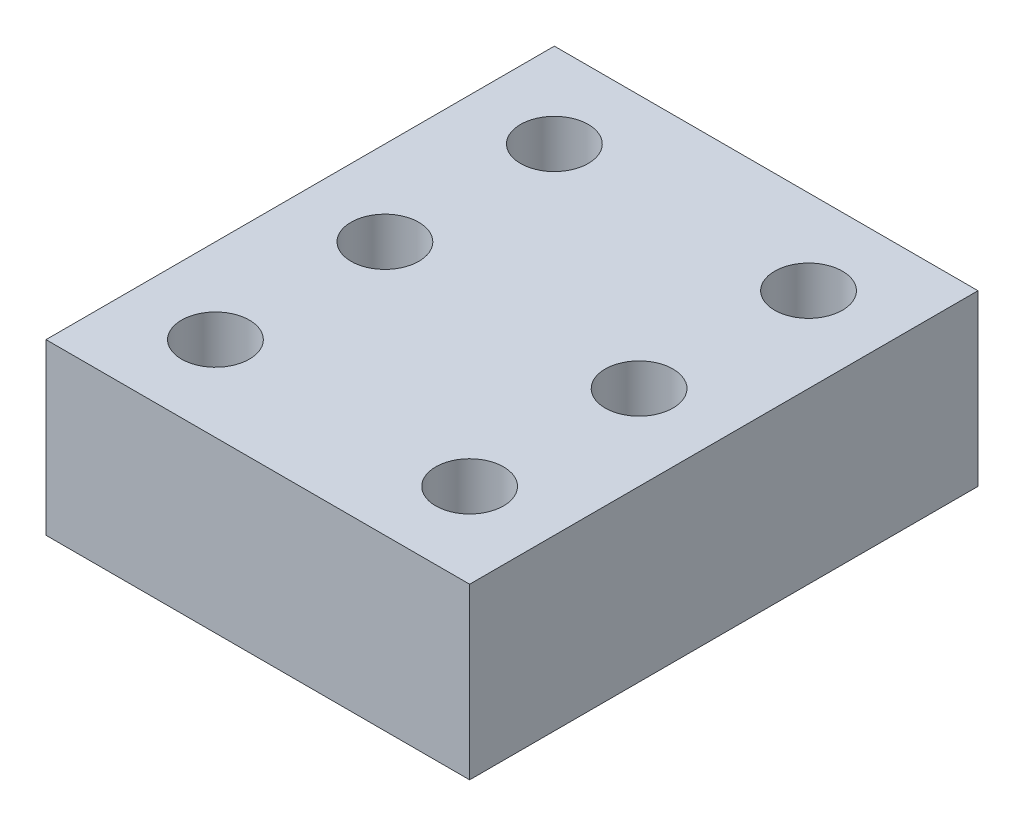
ISO-10303-21;
HEADER;
FILE_DESCRIPTION(('STEP AP214'),'2;1');
FILE_NAME('part.step','',(''),(''),'','','');
FILE_SCHEMA(('AUTOMOTIVE_DESIGN { 1 0 10303 214 1 1 1 1 }'));
ENDSEC;
DATA;
#1=APPLICATION_CONTEXT('core data for automotive mechanical design processes');
#2=APPLICATION_PROTOCOL_DEFINITION('international standard','automotive_design',2000,#1);
#3=PRODUCT_CONTEXT('',#1,'mechanical');
#4=PRODUCT('Part','Part','',(#3));
#5=PRODUCT_RELATED_PRODUCT_CATEGORY('part','',(#4));
#6=PRODUCT_DEFINITION_FORMATION('','',#4);
#7=PRODUCT_DEFINITION_CONTEXT('part definition',#1,'design');
#8=PRODUCT_DEFINITION('design','',#6,#7);
#9=PRODUCT_DEFINITION_SHAPE('','',#8);
#10=(LENGTH_UNIT() NAMED_UNIT(*) SI_UNIT(.MILLI.,.METRE.));
#11=(NAMED_UNIT(*) PLANE_ANGLE_UNIT() SI_UNIT($,.RADIAN.));
#12=(NAMED_UNIT(*) SI_UNIT($,.STERADIAN.) SOLID_ANGLE_UNIT());
#13=UNCERTAINTY_MEASURE_WITH_UNIT(LENGTH_MEASURE(1.E-05),#10,'distance_accuracy_value','');
#14=(GEOMETRIC_REPRESENTATION_CONTEXT(3) GLOBAL_UNCERTAINTY_ASSIGNED_CONTEXT((#13)) GLOBAL_UNIT_ASSIGNED_CONTEXT((#10,
#11,#12)) REPRESENTATION_CONTEXT('',''));
#15=CARTESIAN_POINT('',(0.,0.,0.));
#16=DIRECTION('',(0.,0.,1.));
#17=DIRECTION('',(1.,0.,0.));
#18=AXIS2_PLACEMENT_3D('',#15,#16,#17);
#19=CARTESIAN_POINT('',(0.,10.,0.));
#20=DIRECTION('',(0.,1.,0.));
#21=DIRECTION('',(0.,0.,1.));
#22=AXIS2_PLACEMENT_3D('',#19,#20,#21);
#23=PLANE('',#22);
#24=CARTESIAN_POINT('',(-7.5,10.,0.));
#25=DIRECTION('',(0.,1.,0.));
#26=DIRECTION('',(0.,0.,1.));
#27=AXIS2_PLACEMENT_3D('',#24,#25,#26);
#28=CIRCLE('',#27,2.);
#29=CARTESIAN_POINT('',(-7.5,10.,2.));
#30=VERTEX_POINT('',#29);
#31=EDGE_CURVE('E133',#30,#30,#28,.T.);
#32=ORIENTED_EDGE('',*,*,#31,.F.);
#33=EDGE_LOOP('',(#32));
#34=FACE_BOUND('',#33,.T.);
#35=CARTESIAN_POINT('',(7.5,10.,10.));
#36=DIRECTION('',(0.,1.,0.));
#37=DIRECTION('',(0.,0.,1.));
#38=AXIS2_PLACEMENT_3D('',#35,#36,#37);
#39=CIRCLE('',#38,2.);
#40=CARTESIAN_POINT('',(7.5,10.,12.));
#41=VERTEX_POINT('',#40);
#42=EDGE_CURVE('E121',#41,#41,#39,.T.);
#43=ORIENTED_EDGE('',*,*,#42,.F.);
#44=EDGE_LOOP('',(#43));
#45=FACE_BOUND('',#44,.T.);
#46=CARTESIAN_POINT('',(-7.5,10.,-10.));
#47=DIRECTION('',(0.,1.,0.));
#48=DIRECTION('',(0.,0.,1.));
#49=AXIS2_PLACEMENT_3D('',#46,#47,#48);
#50=CIRCLE('',#49,2.);
#51=CARTESIAN_POINT('',(-7.5,10.,-8.));
#52=VERTEX_POINT('',#51);
#53=EDGE_CURVE('E100',#52,#52,#50,.T.);
#54=ORIENTED_EDGE('',*,*,#53,.F.);
#55=EDGE_LOOP('',(#54));
#56=FACE_BOUND('',#55,.T.);
#57=DIRECTION('',(0.,0.,1.));
#58=VECTOR('',#57,1.);
#59=CARTESIAN_POINT('',(-12.5,10.,-15.));
#60=LINE('',#59,#58);
#61=CARTESIAN_POINT('',(-12.5,10.,-15.));
#62=VERTEX_POINT('',#61);
#63=CARTESIAN_POINT('',(-12.5,10.,15.));
#64=VERTEX_POINT('',#63);
#65=EDGE_CURVE('E85',#62,#64,#60,.T.);
#66=ORIENTED_EDGE('',*,*,#65,.T.);
#67=DIRECTION('',(1.,0.,0.));
#68=VECTOR('',#67,1.);
#69=CARTESIAN_POINT('',(-12.5,10.,15.));
#70=LINE('',#69,#68);
#71=CARTESIAN_POINT('',(12.5,10.,15.));
#72=VERTEX_POINT('',#71);
#73=EDGE_CURVE('E80',#64,#72,#70,.T.);
#74=ORIENTED_EDGE('',*,*,#73,.T.);
#75=DIRECTION('',(0.,0.,-1.));
#76=VECTOR('',#75,1.);
#77=CARTESIAN_POINT('',(12.5,10.,-15.));
#78=LINE('',#77,#76);
#79=CARTESIAN_POINT('',(12.5,10.,-15.));
#80=VERTEX_POINT('',#79);
#81=EDGE_CURVE('E83',#72,#80,#78,.T.);
#82=ORIENTED_EDGE('',*,*,#81,.T.);
#83=DIRECTION('',(-1.,0.,0.));
#84=VECTOR('',#83,1.);
#85=CARTESIAN_POINT('',(-12.5,10.,-15.));
#86=LINE('',#85,#84);
#87=EDGE_CURVE('E50',#80,#62,#86,.T.);
#88=ORIENTED_EDGE('',*,*,#87,.T.);
#89=EDGE_LOOP('',(#66,#74,#82,#88));
#90=FACE_BOUND('',#89,.T.);
#91=CARTESIAN_POINT('',(7.5,10.,0.));
#92=DIRECTION('',(0.,1.,0.));
#93=DIRECTION('',(0.,0.,1.));
#94=AXIS2_PLACEMENT_3D('',#91,#92,#93);
#95=CIRCLE('',#94,1.99999999999999);
#96=CARTESIAN_POINT('',(7.5,10.,1.99999999999999));
#97=VERTEX_POINT('',#96);
#98=EDGE_CURVE('E115',#97,#97,#95,.T.);
#99=ORIENTED_EDGE('',*,*,#98,.F.);
#100=EDGE_LOOP('',(#99));
#101=FACE_BOUND('',#100,.T.);
#102=CARTESIAN_POINT('',(-7.5,10.,10.));
#103=DIRECTION('',(0.,1.,0.));
#104=DIRECTION('',(0.,0.,1.));
#105=AXIS2_PLACEMENT_3D('',#102,#103,#104);
#106=CIRCLE('',#105,2.);
#107=CARTESIAN_POINT('',(-7.5,10.,12.));
#108=VERTEX_POINT('',#107);
#109=EDGE_CURVE('E127',#108,#108,#106,.T.);
#110=ORIENTED_EDGE('',*,*,#109,.F.);
#111=EDGE_LOOP('',(#110));
#112=FACE_BOUND('',#111,.T.);
#113=CARTESIAN_POINT('',(7.5,10.,-10.));
#114=DIRECTION('',(0.,1.,0.));
#115=DIRECTION('',(0.,0.,1.));
#116=AXIS2_PLACEMENT_3D('',#113,#114,#115);
#117=CIRCLE('',#116,2.);
#118=CARTESIAN_POINT('',(7.5,10.,-8.));
#119=VERTEX_POINT('',#118);
#120=EDGE_CURVE('E139',#119,#119,#117,.T.);
#121=ORIENTED_EDGE('',*,*,#120,.F.);
#122=EDGE_LOOP('',(#121));
#123=FACE_BOUND('',#122,.T.);
#124=ADVANCED_FACE('F33',(#34,#45,#56,#90,#101,#112,#123),#23,.T.);
#125=CARTESIAN_POINT('',(0.,0.,0.));
#126=DIRECTION('',(0.,1.,0.));
#127=DIRECTION('',(0.,0.,1.));
#128=AXIS2_PLACEMENT_3D('',#125,#126,#127);
#129=PLANE('',#128);
#130=DIRECTION('',(0.,0.,1.));
#131=VECTOR('',#130,1.);
#132=CARTESIAN_POINT('',(-12.5,0.,-15.));
#133=LINE('',#132,#131);
#134=CARTESIAN_POINT('',(-12.5,0.,-15.));
#135=VERTEX_POINT('',#134);
#136=CARTESIAN_POINT('',(-12.5,0.,15.));
#137=VERTEX_POINT('',#136);
#138=EDGE_CURVE('E97',#135,#137,#133,.T.);
#139=ORIENTED_EDGE('',*,*,#138,.F.);
#140=DIRECTION('',(-1.,0.,0.));
#141=VECTOR('',#140,1.);
#142=CARTESIAN_POINT('',(-12.5,0.,-15.));
#143=LINE('',#142,#141);
#144=CARTESIAN_POINT('',(12.5,0.,-15.));
#145=VERTEX_POINT('',#144);
#146=EDGE_CURVE('E73',#145,#135,#143,.T.);
#147=ORIENTED_EDGE('',*,*,#146,.F.);
#148=DIRECTION('',(0.,0.,-1.));
#149=VECTOR('',#148,1.);
#150=CARTESIAN_POINT('',(12.5,0.,-15.));
#151=LINE('',#150,#149);
#152=CARTESIAN_POINT('',(12.5,0.,15.));
#153=VERTEX_POINT('',#152);
#154=EDGE_CURVE('E67',#153,#145,#151,.T.);
#155=ORIENTED_EDGE('',*,*,#154,.F.);
#156=DIRECTION('',(1.,0.,0.));
#157=VECTOR('',#156,1.);
#158=CARTESIAN_POINT('',(-12.5,0.,15.));
#159=LINE('',#158,#157);
#160=EDGE_CURVE('E89',#137,#153,#159,.T.);
#161=ORIENTED_EDGE('',*,*,#160,.F.);
#162=EDGE_LOOP('',(#139,#147,#155,#161));
#163=FACE_BOUND('',#162,.T.);
#164=CARTESIAN_POINT('',(-7.5,0.,-10.));
#165=DIRECTION('',(0.,1.,0.));
#166=DIRECTION('',(0.,0.,1.));
#167=AXIS2_PLACEMENT_3D('',#164,#165,#166);
#168=CIRCLE('',#167,2.);
#169=CARTESIAN_POINT('',(-7.5,0.,-8.));
#170=VERTEX_POINT('',#169);
#171=EDGE_CURVE('E112',#170,#170,#168,.T.);
#172=ORIENTED_EDGE('',*,*,#171,.T.);
#173=EDGE_LOOP('',(#172));
#174=FACE_BOUND('',#173,.T.);
#175=CARTESIAN_POINT('',(7.5,0.,0.));
#176=DIRECTION('',(0.,1.,0.));
#177=DIRECTION('',(0.,0.,1.));
#178=AXIS2_PLACEMENT_3D('',#175,#176,#177);
#179=CIRCLE('',#178,1.99999999999999);
#180=CARTESIAN_POINT('',(7.5,0.,1.99999999999999));
#181=VERTEX_POINT('',#180);
#182=EDGE_CURVE('E118',#181,#181,#179,.T.);
#183=ORIENTED_EDGE('',*,*,#182,.T.);
#184=EDGE_LOOP('',(#183));
#185=FACE_BOUND('',#184,.T.);
#186=CARTESIAN_POINT('',(7.5,0.,10.));
#187=DIRECTION('',(0.,1.,0.));
#188=DIRECTION('',(0.,0.,1.));
#189=AXIS2_PLACEMENT_3D('',#186,#187,#188);
#190=CIRCLE('',#189,2.);
#191=CARTESIAN_POINT('',(7.5,0.,12.));
#192=VERTEX_POINT('',#191);
#193=EDGE_CURVE('E124',#192,#192,#190,.T.);
#194=ORIENTED_EDGE('',*,*,#193,.T.);
#195=EDGE_LOOP('',(#194));
#196=FACE_BOUND('',#195,.T.);
#197=CARTESIAN_POINT('',(-7.5,0.,10.));
#198=DIRECTION('',(0.,1.,0.));
#199=DIRECTION('',(0.,0.,1.));
#200=AXIS2_PLACEMENT_3D('',#197,#198,#199);
#201=CIRCLE('',#200,2.);
#202=CARTESIAN_POINT('',(-7.5,0.,12.));
#203=VERTEX_POINT('',#202);
#204=EDGE_CURVE('E130',#203,#203,#201,.T.);
#205=ORIENTED_EDGE('',*,*,#204,.T.);
#206=EDGE_LOOP('',(#205));
#207=FACE_BOUND('',#206,.T.);
#208=CARTESIAN_POINT('',(-7.5,0.,0.));
#209=DIRECTION('',(0.,1.,0.));
#210=DIRECTION('',(0.,0.,1.));
#211=AXIS2_PLACEMENT_3D('',#208,#209,#210);
#212=CIRCLE('',#211,2.);
#213=CARTESIAN_POINT('',(-7.5,0.,2.));
#214=VERTEX_POINT('',#213);
#215=EDGE_CURVE('E136',#214,#214,#212,.T.);
#216=ORIENTED_EDGE('',*,*,#215,.T.);
#217=EDGE_LOOP('',(#216));
#218=FACE_BOUND('',#217,.T.);
#219=CARTESIAN_POINT('',(7.5,0.,-10.));
#220=DIRECTION('',(0.,1.,0.));
#221=DIRECTION('',(0.,0.,1.));
#222=AXIS2_PLACEMENT_3D('',#219,#220,#221);
#223=CIRCLE('',#222,2.);
#224=CARTESIAN_POINT('',(7.5,0.,-8.));
#225=VERTEX_POINT('',#224);
#226=EDGE_CURVE('E142',#225,#225,#223,.T.);
#227=ORIENTED_EDGE('',*,*,#226,.T.);
#228=EDGE_LOOP('',(#227));
#229=FACE_BOUND('',#228,.T.);
#230=ADVANCED_FACE('F108',(#163,#174,#185,#196,#207,#218,#229),#129,.F.);
#231=CARTESIAN_POINT('',(-12.5,10.,-15.));
#232=DIRECTION('',(1.,0.,0.));
#233=DIRECTION('',(0.,0.,-1.));
#234=AXIS2_PLACEMENT_3D('',#231,#232,#233);
#235=PLANE('',#234);
#236=ORIENTED_EDGE('',*,*,#138,.T.);
#237=DIRECTION('',(0.,-1.,0.));
#238=VECTOR('',#237,1.);
#239=CARTESIAN_POINT('',(-12.5,10.,15.));
#240=LINE('',#239,#238);
#241=EDGE_CURVE('E11',#64,#137,#240,.T.);
#242=ORIENTED_EDGE('',*,*,#241,.F.);
#243=ORIENTED_EDGE('',*,*,#65,.F.);
#244=DIRECTION('',(0.,-1.,0.));
#245=VECTOR('',#244,1.);
#246=CARTESIAN_POINT('',(-12.5,10.,-15.));
#247=LINE('',#246,#245);
#248=EDGE_CURVE('E93',#62,#135,#247,.T.);
#249=ORIENTED_EDGE('',*,*,#248,.T.);
#250=EDGE_LOOP('',(#236,#242,#243,#249));
#251=FACE_BOUND('',#250,.T.);
#252=ADVANCED_FACE('F35',(#251),#235,.F.);
#253=CARTESIAN_POINT('',(-12.5,10.,15.));
#254=DIRECTION('',(0.,0.,-1.));
#255=DIRECTION('',(-1.,0.,0.));
#256=AXIS2_PLACEMENT_3D('',#253,#254,#255);
#257=PLANE('',#256);
#258=ORIENTED_EDGE('',*,*,#160,.T.);
#259=DIRECTION('',(0.,-1.,0.));
#260=VECTOR('',#259,1.);
#261=CARTESIAN_POINT('',(12.5,10.,15.));
#262=LINE('',#261,#260);
#263=EDGE_CURVE('E42',#72,#153,#262,.T.);
#264=ORIENTED_EDGE('',*,*,#263,.F.);
#265=ORIENTED_EDGE('',*,*,#73,.F.);
#266=ORIENTED_EDGE('',*,*,#241,.T.);
#267=EDGE_LOOP('',(#258,#264,#265,#266));
#268=FACE_BOUND('',#267,.T.);
#269=ADVANCED_FACE('F88',(#268),#257,.F.);
#270=CARTESIAN_POINT('',(12.5,10.,-15.));
#271=DIRECTION('',(-1.,0.,0.));
#272=DIRECTION('',(0.,0.,1.));
#273=AXIS2_PLACEMENT_3D('',#270,#271,#272);
#274=PLANE('',#273);
#275=ORIENTED_EDGE('',*,*,#154,.T.);
#276=DIRECTION('',(0.,-1.,0.));
#277=VECTOR('',#276,1.);
#278=CARTESIAN_POINT('',(12.5,10.,-15.));
#279=LINE('',#278,#277);
#280=EDGE_CURVE('E90',#80,#145,#279,.T.);
#281=ORIENTED_EDGE('',*,*,#280,.F.);
#282=ORIENTED_EDGE('',*,*,#81,.F.);
#283=ORIENTED_EDGE('',*,*,#263,.T.);
#284=EDGE_LOOP('',(#275,#281,#282,#283));
#285=FACE_BOUND('',#284,.T.);
#286=ADVANCED_FACE('F91',(#285),#274,.F.);
#287=CARTESIAN_POINT('',(-12.5,10.,-15.));
#288=DIRECTION('',(0.,0.,1.));
#289=DIRECTION('',(1.,0.,0.));
#290=AXIS2_PLACEMENT_3D('',#287,#288,#289);
#291=PLANE('',#290);
#292=ORIENTED_EDGE('',*,*,#146,.T.);
#293=ORIENTED_EDGE('',*,*,#248,.F.);
#294=ORIENTED_EDGE('',*,*,#87,.F.);
#295=ORIENTED_EDGE('',*,*,#280,.T.);
#296=EDGE_LOOP('',(#292,#293,#294,#295));
#297=FACE_BOUND('',#296,.T.);
#298=ADVANCED_FACE('F105',(#297),#291,.F.);
#299=CARTESIAN_POINT('',(-7.5,10.,-10.));
#300=DIRECTION('',(0.,-1.,0.));
#301=DIRECTION('',(0.,0.,-1.));
#302=AXIS2_PLACEMENT_3D('',#299,#300,#301);
#303=CYLINDRICAL_SURFACE('',#302,2.);
#304=ORIENTED_EDGE('',*,*,#53,.T.);
#305=EDGE_LOOP('',(#304));
#306=FACE_BOUND('',#305,.T.);
#307=ORIENTED_EDGE('',*,*,#171,.F.);
#308=EDGE_LOOP('',(#307));
#309=FACE_BOUND('',#308,.T.);
#310=ADVANCED_FACE('F161',(#306,#309),#303,.F.);
#311=CARTESIAN_POINT('',(7.5,10.,0.));
#312=DIRECTION('',(0.,-1.,0.));
#313=DIRECTION('',(0.,0.,-1.));
#314=AXIS2_PLACEMENT_3D('',#311,#312,#313);
#315=CYLINDRICAL_SURFACE('',#314,1.99999999999999);
#316=ORIENTED_EDGE('',*,*,#98,.T.);
#317=EDGE_LOOP('',(#316));
#318=FACE_BOUND('',#317,.T.);
#319=ORIENTED_EDGE('',*,*,#182,.F.);
#320=EDGE_LOOP('',(#319));
#321=FACE_BOUND('',#320,.T.);
#322=ADVANCED_FACE('F207',(#318,#321),#315,.F.);
#323=CARTESIAN_POINT('',(7.5,10.,10.));
#324=DIRECTION('',(0.,-1.,0.));
#325=DIRECTION('',(0.,0.,-1.));
#326=AXIS2_PLACEMENT_3D('',#323,#324,#325);
#327=CYLINDRICAL_SURFACE('',#326,2.);
#328=ORIENTED_EDGE('',*,*,#42,.T.);
#329=EDGE_LOOP('',(#328));
#330=FACE_BOUND('',#329,.T.);
#331=ORIENTED_EDGE('',*,*,#193,.F.);
#332=EDGE_LOOP('',(#331));
#333=FACE_BOUND('',#332,.T.);
#334=ADVANCED_FACE('F215',(#330,#333),#327,.F.);
#335=CARTESIAN_POINT('',(-7.5,10.,10.));
#336=DIRECTION('',(0.,-1.,0.));
#337=DIRECTION('',(0.,0.,-1.));
#338=AXIS2_PLACEMENT_3D('',#335,#336,#337);
#339=CYLINDRICAL_SURFACE('',#338,2.);
#340=ORIENTED_EDGE('',*,*,#109,.T.);
#341=EDGE_LOOP('',(#340));
#342=FACE_BOUND('',#341,.T.);
#343=ORIENTED_EDGE('',*,*,#204,.F.);
#344=EDGE_LOOP('',(#343));
#345=FACE_BOUND('',#344,.T.);
#346=ADVANCED_FACE('F223',(#342,#345),#339,.F.);
#347=CARTESIAN_POINT('',(-7.5,10.,0.));
#348=DIRECTION('',(0.,-1.,0.));
#349=DIRECTION('',(0.,0.,-1.));
#350=AXIS2_PLACEMENT_3D('',#347,#348,#349);
#351=CYLINDRICAL_SURFACE('',#350,2.);
#352=ORIENTED_EDGE('',*,*,#31,.T.);
#353=EDGE_LOOP('',(#352));
#354=FACE_BOUND('',#353,.T.);
#355=ORIENTED_EDGE('',*,*,#215,.F.);
#356=EDGE_LOOP('',(#355));
#357=FACE_BOUND('',#356,.T.);
#358=ADVANCED_FACE('F232',(#354,#357),#351,.F.);
#359=CARTESIAN_POINT('',(7.5,10.,-10.));
#360=DIRECTION('',(0.,-1.,0.));
#361=DIRECTION('',(0.,0.,-1.));
#362=AXIS2_PLACEMENT_3D('',#359,#360,#361);
#363=CYLINDRICAL_SURFACE('',#362,2.);
#364=ORIENTED_EDGE('',*,*,#120,.T.);
#365=EDGE_LOOP('',(#364));
#366=FACE_BOUND('',#365,.T.);
#367=ORIENTED_EDGE('',*,*,#226,.F.);
#368=EDGE_LOOP('',(#367));
#369=FACE_BOUND('',#368,.T.);
#370=ADVANCED_FACE('F148',(#366,#369),#363,.F.);
#371=CLOSED_SHELL('',(#124,#230,#252,#269,#286,#298,#310,#322,#334,#346,#358,#370));
#372=MANIFOLD_SOLID_BREP('B2',#371);
#373=ADVANCED_BREP_SHAPE_REPRESENTATION('',(#18,#372),#14);
#374=SHAPE_DEFINITION_REPRESENTATION(#9,#373);
ENDSEC;
END-ISO-10303-21;
